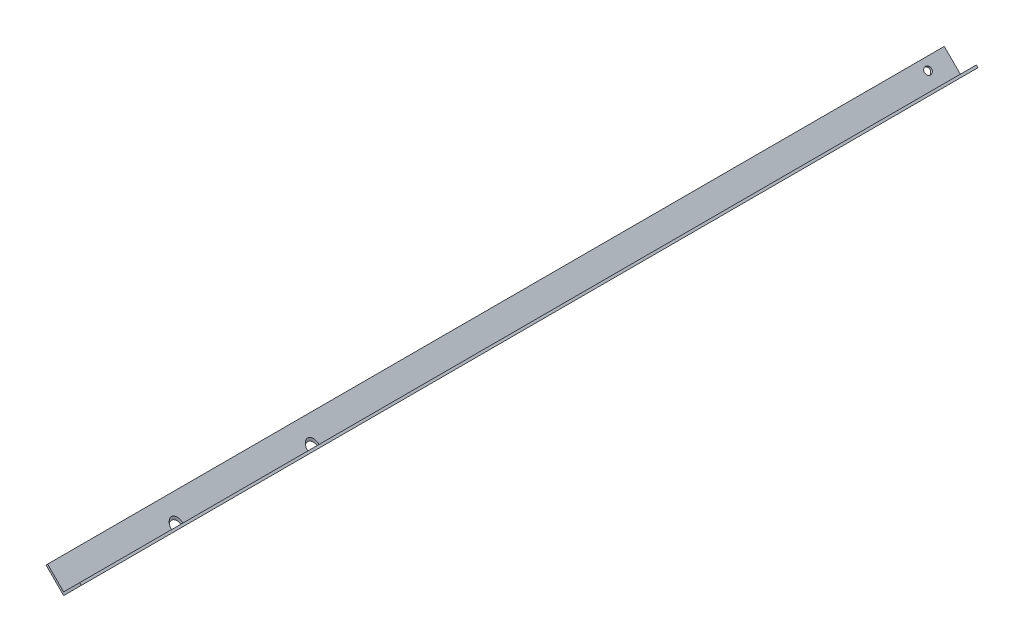
ISO-10303-21;
HEADER;
FILE_DESCRIPTION(('STEP AP214'),'2;1');
FILE_NAME('part.step','',(''),(''),'','','');
FILE_SCHEMA(('AUTOMOTIVE_DESIGN { 1 0 10303 214 1 1 1 1 }'));
ENDSEC;
DATA;
#1=APPLICATION_CONTEXT('core data for automotive mechanical design processes');
#2=APPLICATION_PROTOCOL_DEFINITION('international standard','automotive_design',2000,#1);
#3=PRODUCT_CONTEXT('',#1,'mechanical');
#4=PRODUCT('Part','Part','',(#3));
#5=PRODUCT_RELATED_PRODUCT_CATEGORY('part','',(#4));
#6=PRODUCT_DEFINITION_FORMATION('','',#4);
#7=PRODUCT_DEFINITION_CONTEXT('part definition',#1,'design');
#8=PRODUCT_DEFINITION('design','',#6,#7);
#9=PRODUCT_DEFINITION_SHAPE('','',#8);
#10=(LENGTH_UNIT() NAMED_UNIT(*) SI_UNIT(.MILLI.,.METRE.));
#11=(NAMED_UNIT(*) PLANE_ANGLE_UNIT() SI_UNIT($,.RADIAN.));
#12=(NAMED_UNIT(*) SI_UNIT($,.STERADIAN.) SOLID_ANGLE_UNIT());
#13=UNCERTAINTY_MEASURE_WITH_UNIT(LENGTH_MEASURE(1.E-05),#10,'distance_accuracy_value','');
#14=(GEOMETRIC_REPRESENTATION_CONTEXT(3) GLOBAL_UNCERTAINTY_ASSIGNED_CONTEXT((#13)) GLOBAL_UNIT_ASSIGNED_CONTEXT((#10,
#11,#12)) REPRESENTATION_CONTEXT('',''));
#15=CARTESIAN_POINT('',(0.,0.,0.));
#16=DIRECTION('',(0.,0.,1.));
#17=DIRECTION('',(1.,0.,0.));
#18=AXIS2_PLACEMENT_3D('',#15,#16,#17);
#19=CARTESIAN_POINT('',(8.98025612106916,8.98025612106915,501.65));
#20=DIRECTION('',(0.707106781186547,-0.707106781186548,0.));
#21=DIRECTION('',(0.707106781186548,0.707106781186547,0.));
#22=AXIS2_PLACEMENT_3D('',#19,#20,#21);
#23=PLANE('',#22);
#24=CARTESIAN_POINT('',(5.38815367264149,5.38815367264149,6.35));
#25=DIRECTION('',(-0.707106781186547,0.707106781186548,0.));
#26=DIRECTION('',(-0.707106781186548,-0.707106781186547,0.));
#27=AXIS2_PLACEMENT_3D('',#24,#25,#26);
#28=CIRCLE('',#27,1.984375);
#29=CARTESIAN_POINT('',(3.98498865372444,3.98498865372443,6.35));
#30=VERTEX_POINT('',#29);
#31=EDGE_CURVE('E161',#30,#30,#28,.T.);
#32=ORIENTED_EDGE('',*,*,#31,.F.);
#33=EDGE_LOOP('',(#32));
#34=FACE_BOUND('',#33,.T.);
#35=CARTESIAN_POINT('',(5.38815367264149,5.38815367264149,19.05));
#36=DIRECTION('',(-0.707106781186547,0.707106781186548,0.));
#37=DIRECTION('',(-0.707106781186548,-0.707106781186547,0.));
#38=AXIS2_PLACEMENT_3D('',#35,#36,#37);
#39=CIRCLE('',#38,1.984375);
#40=CARTESIAN_POINT('',(3.98498865372444,3.98498865372443,19.05));
#41=VERTEX_POINT('',#40);
#42=EDGE_CURVE('E169',#41,#41,#39,.T.);
#43=ORIENTED_EDGE('',*,*,#42,.F.);
#44=EDGE_LOOP('',(#43));
#45=FACE_BOUND('',#44,.T.);
#46=DIRECTION('',(0.,0.,-1.));
#47=VECTOR('',#46,1.);
#48=CARTESIAN_POINT('',(0.,0.,501.65));
#49=LINE('',#48,#47);
#50=CARTESIAN_POINT('',(0.,0.,434.975));
#51=VERTEX_POINT('',#50);
#52=CARTESIAN_POINT('',(0.,0.,365.125));
#53=VERTEX_POINT('',#52);
#54=EDGE_CURVE('E155',#51,#53,#49,.T.);
#55=ORIENTED_EDGE('',*,*,#54,.F.);
#56=CARTESIAN_POINT('',(0.,0.,438.15));
#57=DIRECTION('',(0.707106781186547,-0.707106781186548,0.));
#58=DIRECTION('',(0.707106781186548,0.707106781186547,0.));
#59=AXIS2_PLACEMENT_3D('',#56,#57,#58);
#60=ELLIPSE('',#59,4.49012806053457,3.175);
#61=CARTESIAN_POINT('',(0.,0.,441.325));
#62=VERTEX_POINT('',#61);
#63=EDGE_CURVE('E59',#51,#62,#60,.T.);
#64=ORIENTED_EDGE('',*,*,#63,.T.);
#65=CARTESIAN_POINT('',(0.,0.,501.65));
#66=VERTEX_POINT('',#65);
#67=EDGE_CURVE('E121',#66,#62,#49,.T.);
#68=ORIENTED_EDGE('',*,*,#67,.F.);
#69=DIRECTION('',(-0.707106781186548,-0.707106781186547,0.));
#70=VECTOR('',#69,1.);
#71=CARTESIAN_POINT('',(8.98025612106916,8.98025612106915,501.65));
#72=LINE('',#71,#70);
#73=CARTESIAN_POINT('',(8.98025612106916,8.98025612106915,501.65));
#74=VERTEX_POINT('',#73);
#75=EDGE_CURVE('E189',#74,#66,#72,.T.);
#76=ORIENTED_EDGE('',*,*,#75,.F.);
#77=DIRECTION('',(0.,0.,-1.));
#78=VECTOR('',#77,1.);
#79=CARTESIAN_POINT('',(8.98025612106916,8.98025612106915,501.65));
#80=LINE('',#79,#78);
#81=CARTESIAN_POINT('',(8.98025612106916,8.98025612106915,0.));
#82=VERTEX_POINT('',#81);
#83=EDGE_CURVE('E209',#74,#82,#80,.T.);
#84=ORIENTED_EDGE('',*,*,#83,.T.);
#85=DIRECTION('',(-0.707106781186548,-0.707106781186547,0.));
#86=VECTOR('',#85,1.);
#87=CARTESIAN_POINT('',(8.98025612106916,8.98025612106915,0.));
#88=LINE('',#87,#86);
#89=CARTESIAN_POINT('',(0.,0.,0.));
#90=VERTEX_POINT('',#89);
#91=EDGE_CURVE('E165',#82,#90,#88,.T.);
#92=ORIENTED_EDGE('',*,*,#91,.T.);
#93=CARTESIAN_POINT('',(0.,0.,358.775));
#94=VERTEX_POINT('',#93);
#95=EDGE_CURVE('E151',#94,#90,#49,.T.);
#96=ORIENTED_EDGE('',*,*,#95,.F.);
#97=CARTESIAN_POINT('',(0.,0.,361.95));
#98=DIRECTION('',(0.707106781186547,-0.707106781186548,0.));
#99=DIRECTION('',(0.707106781186548,0.707106781186547,0.));
#100=AXIS2_PLACEMENT_3D('',#97,#98,#99);
#101=ELLIPSE('',#100,4.49012806053457,3.175);
#102=EDGE_CURVE('E52',#94,#53,#101,.T.);
#103=ORIENTED_EDGE('',*,*,#102,.T.);
#104=EDGE_LOOP('',(#55,#64,#68,#76,#84,#92,#96,#103));
#105=FACE_BOUND('',#104,.T.);
#106=ADVANCED_FACE('F38',(#34,#45,#105),#23,.F.);
#107=CARTESIAN_POINT('',(0.,0.,501.65));
#108=DIRECTION('',(-0.707106781186548,-0.707106781186547,0.));
#109=DIRECTION('',(0.707106781186547,-0.707106781186548,0.));
#110=AXIS2_PLACEMENT_3D('',#107,#108,#109);
#111=PLANE('',#110);
#112=CARTESIAN_POINT('',(-5.38815367264149,5.3881536726415,12.7));
#113=DIRECTION('',(0.707106781186548,0.707106781186547,0.));
#114=DIRECTION('',(-0.707106781186547,0.707106781186548,0.));
#115=AXIS2_PLACEMENT_3D('',#112,#113,#114);
#116=CIRCLE('',#115,1.984375);
#117=CARTESIAN_POINT('',(-6.79131869155854,6.79131869155855,12.7));
#118=VERTEX_POINT('',#117);
#119=EDGE_CURVE('E170',#118,#118,#116,.T.);
#120=ORIENTED_EDGE('',*,*,#119,.F.);
#121=EDGE_LOOP('',(#120));
#122=FACE_BOUND('',#121,.T.);
#123=ORIENTED_EDGE('',*,*,#67,.T.);
#124=CARTESIAN_POINT('',(0.,0.,438.15));
#125=DIRECTION('',(-0.707106781186548,-0.707106781186547,0.));
#126=DIRECTION('',(-0.707106781186547,0.707106781186548,0.));
#127=AXIS2_PLACEMENT_3D('',#124,#125,#126);
#128=ELLIPSE('',#127,4.49012806053458,3.175);
#129=EDGE_CURVE('E182',#62,#51,#128,.T.);
#130=ORIENTED_EDGE('',*,*,#129,.T.);
#131=ORIENTED_EDGE('',*,*,#54,.T.);
#132=CARTESIAN_POINT('',(0.,0.,361.95));
#133=DIRECTION('',(-0.707106781186548,-0.707106781186547,0.));
#134=DIRECTION('',(-0.707106781186547,0.707106781186548,0.));
#135=AXIS2_PLACEMENT_3D('',#132,#133,#134);
#136=ELLIPSE('',#135,4.49012806053458,3.175);
#137=EDGE_CURVE('E130',#53,#94,#136,.T.);
#138=ORIENTED_EDGE('',*,*,#137,.T.);
#139=ORIENTED_EDGE('',*,*,#95,.T.);
#140=DIRECTION('',(-0.707106781186547,0.707106781186548,0.));
#141=VECTOR('',#140,1.);
#142=CARTESIAN_POINT('',(0.,0.,0.));
#143=LINE('',#142,#141);
#144=CARTESIAN_POINT('',(-8.98025612106914,8.98025612106916,0.));
#145=VERTEX_POINT('',#144);
#146=EDGE_CURVE('E213',#90,#145,#143,.T.);
#147=ORIENTED_EDGE('',*,*,#146,.T.);
#148=DIRECTION('',(0.,0.,-1.));
#149=VECTOR('',#148,1.);
#150=CARTESIAN_POINT('',(-8.98025612106914,8.98025612106916,501.65));
#151=LINE('',#150,#149);
#152=CARTESIAN_POINT('',(-8.98025612106914,8.98025612106916,501.65));
#153=VERTEX_POINT('',#152);
#154=EDGE_CURVE('E147',#153,#145,#151,.T.);
#155=ORIENTED_EDGE('',*,*,#154,.F.);
#156=DIRECTION('',(-0.707106781186547,0.707106781186548,0.));
#157=VECTOR('',#156,1.);
#158=CARTESIAN_POINT('',(0.,0.,501.65));
#159=LINE('',#158,#157);
#160=EDGE_CURVE('E193',#66,#153,#159,.T.);
#161=ORIENTED_EDGE('',*,*,#160,.F.);
#162=EDGE_LOOP('',(#123,#130,#131,#138,#139,#147,#155,#161));
#163=FACE_BOUND('',#162,.T.);
#164=ADVANCED_FACE('F252',(#122,#163),#111,.F.);
#165=CARTESIAN_POINT('',(-8.98025612106914,8.98025612106916,501.65));
#166=DIRECTION('',(0.707106781186547,-0.707106781186548,0.));
#167=DIRECTION('',(0.707106781186548,0.707106781186547,0.));
#168=AXIS2_PLACEMENT_3D('',#165,#166,#167);
#169=PLANE('',#168);
#170=DIRECTION('',(-0.707106781186548,-0.707106781186547,0.));
#171=VECTOR('',#170,1.);
#172=CARTESIAN_POINT('',(-8.98025612106914,8.98025612106916,0.));
#173=LINE('',#172,#171);
#174=CARTESIAN_POINT('',(-9.87828173317606,8.08223050896225,0.));
#175=VERTEX_POINT('',#174);
#176=EDGE_CURVE('E216',#145,#175,#173,.T.);
#177=ORIENTED_EDGE('',*,*,#176,.T.);
#178=DIRECTION('',(0.,0.,-1.));
#179=VECTOR('',#178,1.);
#180=CARTESIAN_POINT('',(-9.87828173317606,8.08223050896225,501.65));
#181=LINE('',#180,#179);
#182=CARTESIAN_POINT('',(-9.87828173317606,8.08223050896225,501.65));
#183=VERTEX_POINT('',#182);
#184=EDGE_CURVE('E139',#183,#175,#181,.T.);
#185=ORIENTED_EDGE('',*,*,#184,.F.);
#186=DIRECTION('',(-0.707106781186548,-0.707106781186547,0.));
#187=VECTOR('',#186,1.);
#188=CARTESIAN_POINT('',(-8.98025612106914,8.98025612106916,501.65));
#189=LINE('',#188,#187);
#190=EDGE_CURVE('E197',#153,#183,#189,.T.);
#191=ORIENTED_EDGE('',*,*,#190,.F.);
#192=ORIENTED_EDGE('',*,*,#154,.T.);
#193=EDGE_LOOP('',(#177,#185,#191,#192));
#194=FACE_BOUND('',#193,.T.);
#195=ADVANCED_FACE('F283',(#194),#169,.F.);
#196=CARTESIAN_POINT('',(-9.87828173317606,8.08223050896225,501.65));
#197=DIRECTION('',(0.707106781186548,0.707106781186547,0.));
#198=DIRECTION('',(-0.707106781186547,0.707106781186548,0.));
#199=AXIS2_PLACEMENT_3D('',#196,#197,#198);
#200=PLANE('',#199);
#201=CARTESIAN_POINT('',(-6.2861792847484,4.49012806053458,12.7));
#202=DIRECTION('',(0.707106781186548,0.707106781186547,0.));
#203=DIRECTION('',(-0.707106781186547,0.707106781186548,0.));
#204=AXIS2_PLACEMENT_3D('',#201,#202,#203);
#205=CIRCLE('',#204,1.984375);
#206=CARTESIAN_POINT('',(-7.68934430366546,5.89329307945164,12.7));
#207=VERTEX_POINT('',#206);
#208=EDGE_CURVE('E166',#207,#207,#205,.T.);
#209=ORIENTED_EDGE('',*,*,#208,.T.);
#210=EDGE_LOOP('',(#209));
#211=FACE_BOUND('',#210,.T.);
#212=DIRECTION('',(0.,0.,-1.));
#213=VECTOR('',#212,1.);
#214=CARTESIAN_POINT('',(0.,-1.79605122421383,501.65));
#215=LINE('',#214,#213);
#216=CARTESIAN_POINT('',(0.,-1.79605122421383,434.975));
#217=VERTEX_POINT('',#216);
#218=CARTESIAN_POINT('',(0.,-1.79605122421383,365.125));
#219=VERTEX_POINT('',#218);
#220=EDGE_CURVE('E126',#217,#219,#215,.T.);
#221=ORIENTED_EDGE('',*,*,#220,.F.);
#222=CARTESIAN_POINT('',(0.,-1.79605122421383,438.15));
#223=DIRECTION('',(0.707106781186548,0.707106781186547,0.));
#224=DIRECTION('',(-0.707106781186547,0.707106781186548,0.));
#225=AXIS2_PLACEMENT_3D('',#222,#223,#224);
#226=ELLIPSE('',#225,4.49012806053458,3.175);
#227=CARTESIAN_POINT('',(0.,-1.79605122421383,441.325));
#228=VERTEX_POINT('',#227);
#229=EDGE_CURVE('E260',#217,#228,#226,.T.);
#230=ORIENTED_EDGE('',*,*,#229,.T.);
#231=CARTESIAN_POINT('',(0.,-1.79605122421383,501.65));
#232=VERTEX_POINT('',#231);
#233=EDGE_CURVE('E135',#232,#228,#215,.T.);
#234=ORIENTED_EDGE('',*,*,#233,.F.);
#235=DIRECTION('',(0.707106781186547,-0.707106781186548,0.));
#236=VECTOR('',#235,1.);
#237=CARTESIAN_POINT('',(-9.87828173317606,8.08223050896225,501.65));
#238=LINE('',#237,#236);
#239=EDGE_CURVE('E200',#183,#232,#238,.T.);
#240=ORIENTED_EDGE('',*,*,#239,.F.);
#241=ORIENTED_EDGE('',*,*,#184,.T.);
#242=DIRECTION('',(0.707106781186547,-0.707106781186548,0.));
#243=VECTOR('',#242,1.);
#244=CARTESIAN_POINT('',(-9.87828173317606,8.08223050896225,0.));
#245=LINE('',#244,#243);
#246=CARTESIAN_POINT('',(0.,-1.79605122421383,0.));
#247=VERTEX_POINT('',#246);
#248=EDGE_CURVE('E219',#175,#247,#245,.T.);
#249=ORIENTED_EDGE('',*,*,#248,.T.);
#250=CARTESIAN_POINT('',(0.,-1.79605122421383,358.775));
#251=VERTEX_POINT('',#250);
#252=EDGE_CURVE('E128',#251,#247,#215,.T.);
#253=ORIENTED_EDGE('',*,*,#252,.F.);
#254=CARTESIAN_POINT('',(0.,-1.79605122421383,361.95));
#255=DIRECTION('',(0.707106781186548,0.707106781186547,0.));
#256=DIRECTION('',(-0.707106781186547,0.707106781186548,0.));
#257=AXIS2_PLACEMENT_3D('',#254,#255,#256);
#258=ELLIPSE('',#257,4.49012806053458,3.175);
#259=EDGE_CURVE('E116',#251,#219,#258,.T.);
#260=ORIENTED_EDGE('',*,*,#259,.T.);
#261=EDGE_LOOP('',(#221,#230,#234,#240,#241,#249,#253,#260));
#262=FACE_BOUND('',#261,.T.);
#263=ADVANCED_FACE('F124',(#211,#262),#200,.F.);
#264=CARTESIAN_POINT('',(0.,-1.79605122421383,501.65));
#265=DIRECTION('',(-0.707106781186547,0.707106781186548,0.));
#266=DIRECTION('',(-0.707106781186548,-0.707106781186547,0.));
#267=AXIS2_PLACEMENT_3D('',#264,#265,#266);
#268=PLANE('',#267);
#269=CARTESIAN_POINT('',(6.28617928474841,4.49012806053457,6.35));
#270=DIRECTION('',(-0.707106781186547,0.707106781186548,0.));
#271=DIRECTION('',(-0.707106781186548,-0.707106781186547,0.));
#272=AXIS2_PLACEMENT_3D('',#269,#270,#271);
#273=CIRCLE('',#272,1.984375);
#274=CARTESIAN_POINT('',(4.88301426583135,3.08696304161751,6.35));
#275=VERTEX_POINT('',#274);
#276=EDGE_CURVE('E160',#275,#275,#273,.T.);
#277=ORIENTED_EDGE('',*,*,#276,.T.);
#278=EDGE_LOOP('',(#277));
#279=FACE_BOUND('',#278,.T.);
#280=CARTESIAN_POINT('',(6.28617928474841,4.49012806053457,19.05));
#281=DIRECTION('',(-0.707106781186547,0.707106781186548,0.));
#282=DIRECTION('',(-0.707106781186548,-0.707106781186547,0.));
#283=AXIS2_PLACEMENT_3D('',#280,#281,#282);
#284=CIRCLE('',#283,1.984375);
#285=CARTESIAN_POINT('',(4.88301426583135,3.08696304161751,19.05));
#286=VERTEX_POINT('',#285);
#287=EDGE_CURVE('E156',#286,#286,#284,.T.);
#288=ORIENTED_EDGE('',*,*,#287,.T.);
#289=EDGE_LOOP('',(#288));
#290=FACE_BOUND('',#289,.T.);
#291=ORIENTED_EDGE('',*,*,#233,.T.);
#292=CARTESIAN_POINT('',(0.,-1.79605122421383,438.15));
#293=DIRECTION('',(-0.707106781186547,0.707106781186548,0.));
#294=DIRECTION('',(0.707106781186548,0.707106781186547,0.));
#295=AXIS2_PLACEMENT_3D('',#292,#293,#294);
#296=ELLIPSE('',#295,4.49012806053457,3.175);
#297=EDGE_CURVE('E11',#228,#217,#296,.T.);
#298=ORIENTED_EDGE('',*,*,#297,.T.);
#299=ORIENTED_EDGE('',*,*,#220,.T.);
#300=CARTESIAN_POINT('',(0.,-1.79605122421383,361.95));
#301=DIRECTION('',(-0.707106781186547,0.707106781186548,0.));
#302=DIRECTION('',(0.707106781186548,0.707106781186547,0.));
#303=AXIS2_PLACEMENT_3D('',#300,#301,#302);
#304=ELLIPSE('',#303,4.49012806053457,3.175);
#305=EDGE_CURVE('E46',#219,#251,#304,.T.);
#306=ORIENTED_EDGE('',*,*,#305,.T.);
#307=ORIENTED_EDGE('',*,*,#252,.T.);
#308=DIRECTION('',(0.707106781186548,0.707106781186547,0.));
#309=VECTOR('',#308,1.);
#310=CARTESIAN_POINT('',(0.,-1.79605122421383,0.));
#311=LINE('',#310,#309);
#312=CARTESIAN_POINT('',(9.87828173317607,8.08223050896223,0.));
#313=VERTEX_POINT('',#312);
#314=EDGE_CURVE('E222',#247,#313,#311,.T.);
#315=ORIENTED_EDGE('',*,*,#314,.T.);
#316=DIRECTION('',(0.,0.,-1.));
#317=VECTOR('',#316,1.);
#318=CARTESIAN_POINT('',(9.87828173317607,8.08223050896223,501.65));
#319=LINE('',#318,#317);
#320=CARTESIAN_POINT('',(9.87828173317607,8.08223050896223,501.65));
#321=VERTEX_POINT('',#320);
#322=EDGE_CURVE('E140',#321,#313,#319,.T.);
#323=ORIENTED_EDGE('',*,*,#322,.F.);
#324=DIRECTION('',(0.707106781186548,0.707106781186547,0.));
#325=VECTOR('',#324,1.);
#326=CARTESIAN_POINT('',(0.,-1.79605122421383,501.65));
#327=LINE('',#326,#325);
#328=EDGE_CURVE('E203',#232,#321,#327,.T.);
#329=ORIENTED_EDGE('',*,*,#328,.F.);
#330=EDGE_LOOP('',(#291,#298,#299,#306,#307,#315,#323,#329));
#331=FACE_BOUND('',#330,.T.);
#332=ADVANCED_FACE('F133',(#279,#290,#331),#268,.F.);
#333=CARTESIAN_POINT('',(9.87828173317607,8.08223050896223,501.65));
#334=DIRECTION('',(-0.707106781186548,-0.707106781186547,0.));
#335=DIRECTION('',(0.707106781186547,-0.707106781186548,0.));
#336=AXIS2_PLACEMENT_3D('',#333,#334,#335);
#337=PLANE('',#336);
#338=DIRECTION('',(-0.707106781186547,0.707106781186548,0.));
#339=VECTOR('',#338,1.);
#340=CARTESIAN_POINT('',(9.87828173317607,8.08223050896223,0.));
#341=LINE('',#340,#339);
#342=EDGE_CURVE('E194',#313,#82,#341,.T.);
#343=ORIENTED_EDGE('',*,*,#342,.T.);
#344=ORIENTED_EDGE('',*,*,#83,.F.);
#345=DIRECTION('',(-0.707106781186547,0.707106781186548,0.));
#346=VECTOR('',#345,1.);
#347=CARTESIAN_POINT('',(9.87828173317607,8.08223050896223,501.65));
#348=LINE('',#347,#346);
#349=EDGE_CURVE('E206',#321,#74,#348,.T.);
#350=ORIENTED_EDGE('',*,*,#349,.F.);
#351=ORIENTED_EDGE('',*,*,#322,.T.);
#352=EDGE_LOOP('',(#343,#344,#350,#351));
#353=FACE_BOUND('',#352,.T.);
#354=ADVANCED_FACE('F238',(#353),#337,.F.);
#355=CARTESIAN_POINT('',(0.,0.,501.65));
#356=DIRECTION('',(0.,0.,-1.));
#357=DIRECTION('',(-1.,0.,0.));
#358=AXIS2_PLACEMENT_3D('',#355,#356,#357);
#359=PLANE('',#358);
#360=ORIENTED_EDGE('',*,*,#75,.T.);
#361=ORIENTED_EDGE('',*,*,#160,.T.);
#362=ORIENTED_EDGE('',*,*,#190,.T.);
#363=ORIENTED_EDGE('',*,*,#239,.T.);
#364=ORIENTED_EDGE('',*,*,#328,.T.);
#365=ORIENTED_EDGE('',*,*,#349,.T.);
#366=EDGE_LOOP('',(#360,#361,#362,#363,#364,#365));
#367=FACE_BOUND('',#366,.T.);
#368=ADVANCED_FACE('F257',(#367),#359,.F.);
#369=CARTESIAN_POINT('',(0.,0.,0.));
#370=DIRECTION('',(0.,0.,-1.));
#371=DIRECTION('',(-1.,0.,0.));
#372=AXIS2_PLACEMENT_3D('',#369,#370,#371);
#373=PLANE('',#372);
#374=ORIENTED_EDGE('',*,*,#91,.F.);
#375=ORIENTED_EDGE('',*,*,#342,.F.);
#376=ORIENTED_EDGE('',*,*,#314,.F.);
#377=ORIENTED_EDGE('',*,*,#248,.F.);
#378=ORIENTED_EDGE('',*,*,#176,.F.);
#379=ORIENTED_EDGE('',*,*,#146,.F.);
#380=EDGE_LOOP('',(#374,#375,#376,#377,#378,#379));
#381=FACE_BOUND('',#380,.T.);
#382=ADVANCED_FACE('F242',(#381),#373,.T.);
#383=CARTESIAN_POINT('',(11.2253201513364,-0.449012806053468,19.05));
#384=DIRECTION('',(-0.707106781186547,0.707106781186548,0.));
#385=DIRECTION('',(-0.707106781186548,-0.707106781186547,0.));
#386=AXIS2_PLACEMENT_3D('',#383,#384,#385);
#387=CYLINDRICAL_SURFACE('',#386,1.984375);
#388=ORIENTED_EDGE('',*,*,#42,.T.);
#389=EDGE_LOOP('',(#388));
#390=FACE_BOUND('',#389,.T.);
#391=ORIENTED_EDGE('',*,*,#287,.F.);
#392=EDGE_LOOP('',(#391));
#393=FACE_BOUND('',#392,.T.);
#394=ADVANCED_FACE('F289',(#390,#393),#387,.F.);
#395=CARTESIAN_POINT('',(11.2253201513364,-0.449012806053468,6.35));
#396=DIRECTION('',(-0.707106781186547,0.707106781186548,0.));
#397=DIRECTION('',(-0.707106781186548,-0.707106781186547,0.));
#398=AXIS2_PLACEMENT_3D('',#395,#396,#397);
#399=CYLINDRICAL_SURFACE('',#398,1.984375);
#400=ORIENTED_EDGE('',*,*,#31,.T.);
#401=EDGE_LOOP('',(#400));
#402=FACE_BOUND('',#401,.T.);
#403=ORIENTED_EDGE('',*,*,#276,.F.);
#404=EDGE_LOOP('',(#403));
#405=FACE_BOUND('',#404,.T.);
#406=ADVANCED_FACE('F292',(#402,#405),#399,.F.);
#407=CARTESIAN_POINT('',(-11.2253201513364,-0.449012806053448,12.7));
#408=DIRECTION('',(0.707106781186548,0.707106781186547,0.));
#409=DIRECTION('',(-0.707106781186547,0.707106781186548,0.));
#410=AXIS2_PLACEMENT_3D('',#407,#408,#409);
#411=CYLINDRICAL_SURFACE('',#410,1.984375);
#412=ORIENTED_EDGE('',*,*,#119,.T.);
#413=EDGE_LOOP('',(#412));
#414=FACE_BOUND('',#413,.T.);
#415=ORIENTED_EDGE('',*,*,#208,.F.);
#416=EDGE_LOOP('',(#415));
#417=FACE_BOUND('',#416,.T.);
#418=ADVANCED_FACE('F275',(#414,#417),#411,.F.);
#419=CARTESIAN_POINT('',(0.,-1.79605122421383,361.95));
#420=DIRECTION('',(0.,1.,0.));
#421=DIRECTION('',(0.,0.,1.));
#422=AXIS2_PLACEMENT_3D('',#419,#420,#421);
#423=CYLINDRICAL_SURFACE('',#422,3.175);
#424=ORIENTED_EDGE('',*,*,#305,.F.);
#425=ORIENTED_EDGE('',*,*,#259,.F.);
#426=EDGE_LOOP('',(#424,#425));
#427=FACE_BOUND('',#426,.T.);
#428=ORIENTED_EDGE('',*,*,#137,.F.);
#429=ORIENTED_EDGE('',*,*,#102,.F.);
#430=EDGE_LOOP('',(#428,#429));
#431=FACE_BOUND('',#430,.T.);
#432=ADVANCED_FACE('F115',(#427,#431),#423,.F.);
#433=CARTESIAN_POINT('',(0.,-1.79605122421383,438.15));
#434=DIRECTION('',(0.,1.,0.));
#435=DIRECTION('',(0.,0.,1.));
#436=AXIS2_PLACEMENT_3D('',#433,#434,#435);
#437=CYLINDRICAL_SURFACE('',#436,3.175);
#438=ORIENTED_EDGE('',*,*,#297,.F.);
#439=ORIENTED_EDGE('',*,*,#229,.F.);
#440=EDGE_LOOP('',(#438,#439));
#441=FACE_BOUND('',#440,.T.);
#442=ORIENTED_EDGE('',*,*,#129,.F.);
#443=ORIENTED_EDGE('',*,*,#63,.F.);
#444=EDGE_LOOP('',(#442,#443));
#445=FACE_BOUND('',#444,.T.);
#446=ADVANCED_FACE('F269',(#441,#445),#437,.F.);
#447=CLOSED_SHELL('',(#106,#164,#195,#263,#332,#354,#368,#382,#394,#406,#418,#432,#446));
#448=MANIFOLD_SOLID_BREP('B2',#447);
#449=ADVANCED_BREP_SHAPE_REPRESENTATION('',(#18,#448),#14);
#450=SHAPE_DEFINITION_REPRESENTATION(#9,#449);
ENDSEC;
END-ISO-10303-21;
